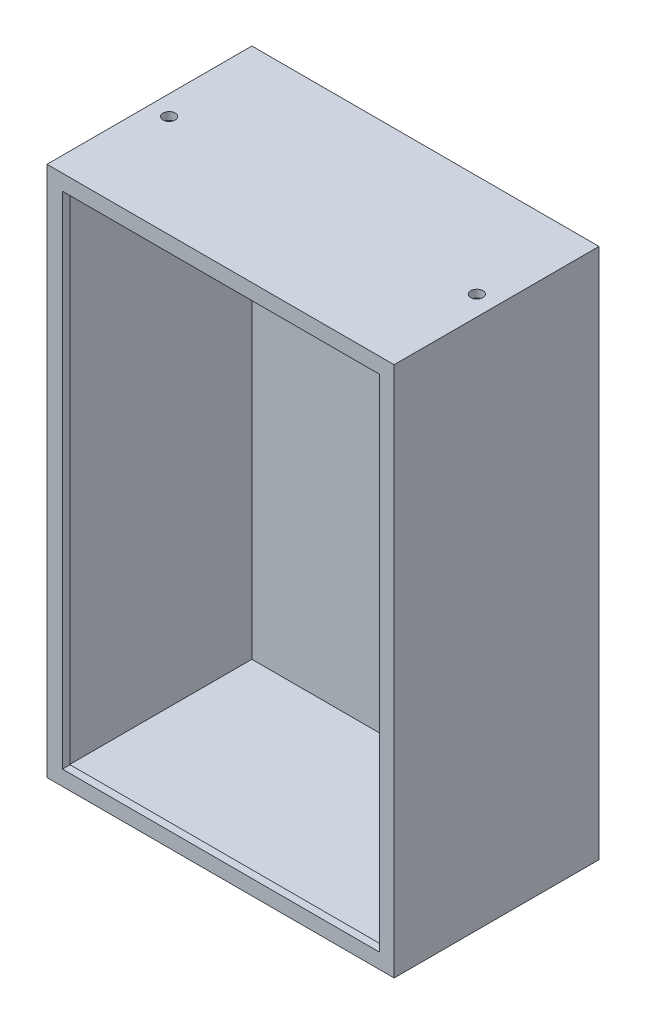
ISO-10303-21;
HEADER;
FILE_DESCRIPTION(('STEP AP214'),'2;1');
FILE_NAME('part.step','',(''),(''),'','','');
FILE_SCHEMA(('AUTOMOTIVE_DESIGN { 1 0 10303 214 1 1 1 1 }'));
ENDSEC;
DATA;
#1=APPLICATION_CONTEXT('core data for automotive mechanical design processes');
#2=APPLICATION_PROTOCOL_DEFINITION('international standard','automotive_design',2000,#1);
#3=PRODUCT_CONTEXT('',#1,'mechanical');
#4=PRODUCT('Part','Part','',(#3));
#5=PRODUCT_RELATED_PRODUCT_CATEGORY('part','',(#4));
#6=PRODUCT_DEFINITION_FORMATION('','',#4);
#7=PRODUCT_DEFINITION_CONTEXT('part definition',#1,'design');
#8=PRODUCT_DEFINITION('design','',#6,#7);
#9=PRODUCT_DEFINITION_SHAPE('','',#8);
#10=(LENGTH_UNIT() NAMED_UNIT(*) SI_UNIT(.MILLI.,.METRE.));
#11=(NAMED_UNIT(*) PLANE_ANGLE_UNIT() SI_UNIT($,.RADIAN.));
#12=(NAMED_UNIT(*) SI_UNIT($,.STERADIAN.) SOLID_ANGLE_UNIT());
#13=UNCERTAINTY_MEASURE_WITH_UNIT(LENGTH_MEASURE(1.E-05),#10,'distance_accuracy_value','');
#14=(GEOMETRIC_REPRESENTATION_CONTEXT(3) GLOBAL_UNCERTAINTY_ASSIGNED_CONTEXT((#13)) GLOBAL_UNIT_ASSIGNED_CONTEXT((#10,
#11,#12)) REPRESENTATION_CONTEXT('',''));
#15=CARTESIAN_POINT('',(0.,0.,0.));
#16=DIRECTION('',(0.,0.,1.));
#17=DIRECTION('',(1.,0.,0.));
#18=AXIS2_PLACEMENT_3D('',#15,#16,#17);
#19=CARTESIAN_POINT('',(-109.375,345.,62.5));
#20=DIRECTION('',(0.,0.,-1.));
#21=DIRECTION('',(-1.,0.,0.));
#22=AXIS2_PLACEMENT_3D('',#19,#20,#21);
#23=PLANE('',#22);
#24=DIRECTION('',(1.,0.,0.));
#25=VECTOR('',#24,1.);
#26=CARTESIAN_POINT('',(-109.375,5.,62.5));
#27=LINE('',#26,#25);
#28=CARTESIAN_POINT('',(-109.375,5.,62.5));
#29=VERTEX_POINT('',#28);
#30=CARTESIAN_POINT('',(109.375,5.,62.5));
#31=VERTEX_POINT('',#30);
#32=EDGE_CURVE('E180',#29,#31,#27,.T.);
#33=ORIENTED_EDGE('',*,*,#32,.F.);
#34=DIRECTION('',(0.,-1.,0.));
#35=VECTOR('',#34,1.);
#36=CARTESIAN_POINT('',(-109.375,345.,62.5));
#37=LINE('',#36,#35);
#38=CARTESIAN_POINT('',(-109.375,345.,62.5));
#39=VERTEX_POINT('',#38);
#40=EDGE_CURVE('E196',#39,#29,#37,.T.);
#41=ORIENTED_EDGE('',*,*,#40,.F.);
#42=DIRECTION('',(1.,0.,0.));
#43=VECTOR('',#42,1.);
#44=CARTESIAN_POINT('',(-109.375,345.,62.5));
#45=LINE('',#44,#43);
#46=CARTESIAN_POINT('',(109.375,345.,62.5));
#47=VERTEX_POINT('',#46);
#48=EDGE_CURVE('E184',#39,#47,#45,.T.);
#49=ORIENTED_EDGE('',*,*,#48,.T.);
#50=DIRECTION('',(0.,-1.,0.));
#51=VECTOR('',#50,1.);
#52=CARTESIAN_POINT('',(109.375,345.,62.5));
#53=LINE('',#52,#51);
#54=EDGE_CURVE('E186',#47,#31,#53,.T.);
#55=ORIENTED_EDGE('',*,*,#54,.T.);
#56=EDGE_LOOP('',(#33,#41,#49,#55));
#57=FACE_BOUND('',#56,.T.);
#58=DIRECTION('',(-1.,0.,0.));
#59=VECTOR('',#58,1.);
#60=CARTESIAN_POINT('',(-104.164967213493,339.723012652688,62.5));
#61=LINE('',#60,#59);
#62=CARTESIAN_POINT('',(104.74795802118,339.723012652688,62.5));
#63=VERTEX_POINT('',#62);
#64=CARTESIAN_POINT('',(-104.164967213493,339.723012652688,62.5));
#65=VERTEX_POINT('',#64);
#66=EDGE_CURVE('E134',#63,#65,#61,.T.);
#67=ORIENTED_EDGE('',*,*,#66,.T.);
#68=DIRECTION('',(0.,-1.,0.));
#69=VECTOR('',#68,1.);
#70=CARTESIAN_POINT('',(-104.164967213493,339.723012652688,62.5));
#71=LINE('',#70,#69);
#72=CARTESIAN_POINT('',(-104.164967213493,9.93613598716966,62.5));
#73=VERTEX_POINT('',#72);
#74=EDGE_CURVE('E130',#65,#73,#71,.T.);
#75=ORIENTED_EDGE('',*,*,#74,.T.);
#76=DIRECTION('',(1.,0.,0.));
#77=VECTOR('',#76,1.);
#78=CARTESIAN_POINT('',(-104.164967213493,9.93613598716966,62.5));
#79=LINE('',#78,#77);
#80=CARTESIAN_POINT('',(104.74795802118,9.93613598716966,62.5));
#81=VERTEX_POINT('',#80);
#82=EDGE_CURVE('E153',#73,#81,#79,.T.);
#83=ORIENTED_EDGE('',*,*,#82,.T.);
#84=DIRECTION('',(0.,1.,0.));
#85=VECTOR('',#84,1.);
#86=CARTESIAN_POINT('',(104.74795802118,339.723012652688,62.5));
#87=LINE('',#86,#85);
#88=EDGE_CURVE('E133',#81,#63,#87,.T.);
#89=ORIENTED_EDGE('',*,*,#88,.T.);
#90=EDGE_LOOP('',(#67,#75,#83,#89));
#91=FACE_BOUND('',#90,.T.);
#92=ADVANCED_FACE('F38',(#57,#91),#23,.T.);
#93=CARTESIAN_POINT('',(109.375,345.,62.5));
#94=DIRECTION('',(-1.,0.,0.));
#95=DIRECTION('',(0.,0.,1.));
#96=AXIS2_PLACEMENT_3D('',#93,#94,#95);
#97=PLANE('',#96);
#98=DIRECTION('',(0.,0.,-1.));
#99=VECTOR('',#98,1.);
#100=CARTESIAN_POINT('',(109.375,5.,62.5));
#101=LINE('',#100,#99);
#102=CARTESIAN_POINT('',(109.375,5.,-62.5));
#103=VERTEX_POINT('',#102);
#104=EDGE_CURVE('E171',#31,#103,#101,.T.);
#105=ORIENTED_EDGE('',*,*,#104,.F.);
#106=ORIENTED_EDGE('',*,*,#54,.F.);
#107=DIRECTION('',(0.,0.,-1.));
#108=VECTOR('',#107,1.);
#109=CARTESIAN_POINT('',(109.375,345.,62.5));
#110=LINE('',#109,#108);
#111=CARTESIAN_POINT('',(109.375,345.,-62.5));
#112=VERTEX_POINT('',#111);
#113=EDGE_CURVE('E176',#47,#112,#110,.T.);
#114=ORIENTED_EDGE('',*,*,#113,.T.);
#115=DIRECTION('',(0.,-1.,0.));
#116=VECTOR('',#115,1.);
#117=CARTESIAN_POINT('',(109.375,345.,-62.5));
#118=LINE('',#117,#116);
#119=EDGE_CURVE('E202',#112,#103,#118,.T.);
#120=ORIENTED_EDGE('',*,*,#119,.T.);
#121=EDGE_LOOP('',(#105,#106,#114,#120));
#122=FACE_BOUND('',#121,.T.);
#123=ADVANCED_FACE('F256',(#122),#97,.T.);
#124=CARTESIAN_POINT('',(-109.375,345.,-62.5));
#125=DIRECTION('',(0.,0.,1.));
#126=DIRECTION('',(1.,0.,0.));
#127=AXIS2_PLACEMENT_3D('',#124,#125,#126);
#128=PLANE('',#127);
#129=DIRECTION('',(-1.,0.,0.));
#130=VECTOR('',#129,1.);
#131=CARTESIAN_POINT('',(-109.375,5.,-62.5));
#132=LINE('',#131,#130);
#133=CARTESIAN_POINT('',(-109.375,5.,-62.5));
#134=VERTEX_POINT('',#133);
#135=EDGE_CURVE('E189',#103,#134,#132,.T.);
#136=ORIENTED_EDGE('',*,*,#135,.F.);
#137=ORIENTED_EDGE('',*,*,#119,.F.);
#138=DIRECTION('',(-1.,0.,0.));
#139=VECTOR('',#138,1.);
#140=CARTESIAN_POINT('',(-109.375,345.,-62.5));
#141=LINE('',#140,#139);
#142=CARTESIAN_POINT('',(-109.375,345.,-62.5));
#143=VERTEX_POINT('',#142);
#144=EDGE_CURVE('E179',#112,#143,#141,.T.);
#145=ORIENTED_EDGE('',*,*,#144,.T.);
#146=DIRECTION('',(0.,-1.,0.));
#147=VECTOR('',#146,1.);
#148=CARTESIAN_POINT('',(-109.375,345.,-62.5));
#149=LINE('',#148,#147);
#150=EDGE_CURVE('E199',#143,#134,#149,.T.);
#151=ORIENTED_EDGE('',*,*,#150,.T.);
#152=EDGE_LOOP('',(#136,#137,#145,#151));
#153=FACE_BOUND('',#152,.T.);
#154=ADVANCED_FACE('F262',(#153),#128,.T.);
#155=CARTESIAN_POINT('',(-109.375,345.,62.5));
#156=DIRECTION('',(1.,0.,0.));
#157=DIRECTION('',(0.,0.,-1.));
#158=AXIS2_PLACEMENT_3D('',#155,#156,#157);
#159=PLANE('',#158);
#160=DIRECTION('',(0.,0.,1.));
#161=VECTOR('',#160,1.);
#162=CARTESIAN_POINT('',(-109.375,5.,62.5));
#163=LINE('',#162,#161);
#164=EDGE_CURVE('E191',#134,#29,#163,.T.);
#165=ORIENTED_EDGE('',*,*,#164,.F.);
#166=ORIENTED_EDGE('',*,*,#150,.F.);
#167=DIRECTION('',(0.,0.,1.));
#168=VECTOR('',#167,1.);
#169=CARTESIAN_POINT('',(-109.375,345.,62.5));
#170=LINE('',#169,#168);
#171=EDGE_CURVE('E182',#143,#39,#170,.T.);
#172=ORIENTED_EDGE('',*,*,#171,.T.);
#173=ORIENTED_EDGE('',*,*,#40,.T.);
#174=EDGE_LOOP('',(#165,#166,#172,#173));
#175=FACE_BOUND('',#174,.T.);
#176=ADVANCED_FACE('F271',(#175),#159,.T.);
#177=CARTESIAN_POINT('',(0.,345.,0.));
#178=DIRECTION('',(0.,1.,0.));
#179=DIRECTION('',(0.,0.,1.));
#180=AXIS2_PLACEMENT_3D('',#177,#178,#179);
#181=PLANE('',#180);
#182=CARTESIAN_POINT('',(-101.375,345.,0.));
#183=DIRECTION('',(0.,1.,0.));
#184=DIRECTION('',(0.,0.,1.));
#185=AXIS2_PLACEMENT_3D('',#182,#183,#184);
#186=CIRCLE('',#185,4.00000000000001);
#187=CARTESIAN_POINT('',(-101.375,345.,4.00000000000001));
#188=VERTEX_POINT('',#187);
#189=EDGE_CURVE('E164',#188,#188,#186,.F.);
#190=ORIENTED_EDGE('',*,*,#189,.F.);
#191=EDGE_LOOP('',(#190));
#192=FACE_BOUND('',#191,.T.);
#193=CARTESIAN_POINT('',(101.375,345.,0.));
#194=DIRECTION('',(0.,1.,0.));
#195=DIRECTION('',(0.,0.,1.));
#196=AXIS2_PLACEMENT_3D('',#193,#194,#195);
#197=CIRCLE('',#196,4.00000000000001);
#198=CARTESIAN_POINT('',(101.375,345.,3.99999999999998));
#199=VERTEX_POINT('',#198);
#200=EDGE_CURVE('E144',#199,#199,#197,.F.);
#201=ORIENTED_EDGE('',*,*,#200,.F.);
#202=EDGE_LOOP('',(#201));
#203=FACE_BOUND('',#202,.T.);
#204=ORIENTED_EDGE('',*,*,#113,.F.);
#205=ORIENTED_EDGE('',*,*,#48,.F.);
#206=ORIENTED_EDGE('',*,*,#171,.F.);
#207=ORIENTED_EDGE('',*,*,#144,.F.);
#208=EDGE_LOOP('',(#204,#205,#206,#207));
#209=FACE_BOUND('',#208,.T.);
#210=ADVANCED_FACE('F274',(#192,#203,#209),#181,.F.);
#211=CARTESIAN_POINT('',(0.,5.,0.));
#212=DIRECTION('',(0.,1.,0.));
#213=DIRECTION('',(0.,0.,1.));
#214=AXIS2_PLACEMENT_3D('',#211,#212,#213);
#215=PLANE('',#214);
#216=ORIENTED_EDGE('',*,*,#104,.T.);
#217=ORIENTED_EDGE('',*,*,#135,.T.);
#218=ORIENTED_EDGE('',*,*,#164,.T.);
#219=ORIENTED_EDGE('',*,*,#32,.T.);
#220=EDGE_LOOP('',(#216,#217,#218,#219));
#221=FACE_BOUND('',#220,.T.);
#222=ADVANCED_FACE('F269',(#221),#215,.T.);
#223=CARTESIAN_POINT('',(101.375,-0.000999999999973245,0.));
#224=DIRECTION('',(0.,1.,0.));
#225=DIRECTION('',(0.,0.,1.));
#226=AXIS2_PLACEMENT_3D('',#223,#224,#225);
#227=CYLINDRICAL_SURFACE('',#226,4.00000000000001);
#228=CARTESIAN_POINT('',(101.375,350.,0.));
#229=DIRECTION('',(0.,1.,0.));
#230=DIRECTION('',(0.,0.,-1.));
#231=AXIS2_PLACEMENT_3D('',#228,#229,#230);
#232=CIRCLE('',#231,4.00000000000001);
#233=CARTESIAN_POINT('',(101.375,350.,-4.00000000000003));
#234=VERTEX_POINT('',#233);
#235=EDGE_CURVE('E168',#234,#234,#232,.T.);
#236=ORIENTED_EDGE('',*,*,#235,.T.);
#237=EDGE_LOOP('',(#236));
#238=FACE_BOUND('',#237,.T.);
#239=ORIENTED_EDGE('',*,*,#200,.T.);
#240=EDGE_LOOP('',(#239));
#241=FACE_BOUND('',#240,.T.);
#242=ADVANCED_FACE('F345',(#238,#241),#227,.F.);
#243=CARTESIAN_POINT('',(-101.375,-0.000999999999973245,0.));
#244=DIRECTION('',(0.,1.,0.));
#245=DIRECTION('',(0.,0.,1.));
#246=AXIS2_PLACEMENT_3D('',#243,#244,#245);
#247=CYLINDRICAL_SURFACE('',#246,4.00000000000001);
#248=CARTESIAN_POINT('',(-101.375,350.,0.));
#249=DIRECTION('',(0.,1.,0.));
#250=DIRECTION('',(0.,0.,1.));
#251=AXIS2_PLACEMENT_3D('',#248,#249,#250);
#252=CIRCLE('',#251,4.00000000000001);
#253=CARTESIAN_POINT('',(-101.375,350.,4.00000000000001));
#254=VERTEX_POINT('',#253);
#255=EDGE_CURVE('E167',#254,#254,#252,.T.);
#256=ORIENTED_EDGE('',*,*,#255,.T.);
#257=EDGE_LOOP('',(#256));
#258=FACE_BOUND('',#257,.T.);
#259=ORIENTED_EDGE('',*,*,#189,.T.);
#260=EDGE_LOOP('',(#259));
#261=FACE_BOUND('',#260,.T.);
#262=ADVANCED_FACE('F254',(#258,#261),#247,.F.);
#263=CARTESIAN_POINT('',(114.375,350.,0.));
#264=DIRECTION('',(-1.,0.,0.));
#265=DIRECTION('',(0.,0.,1.));
#266=AXIS2_PLACEMENT_3D('',#263,#264,#265);
#267=PLANE('',#266);
#268=DIRECTION('',(0.,0.,-1.));
#269=VECTOR('',#268,1.);
#270=CARTESIAN_POINT('',(114.375,0.,0.));
#271=LINE('',#270,#269);
#272=CARTESIAN_POINT('',(114.375,0.,67.5));
#273=VERTEX_POINT('',#272);
#274=CARTESIAN_POINT('',(114.375,0.,-67.5));
#275=VERTEX_POINT('',#274);
#276=EDGE_CURVE('E205',#273,#275,#271,.T.);
#277=ORIENTED_EDGE('',*,*,#276,.T.);
#278=DIRECTION('',(0.,-1.,0.));
#279=VECTOR('',#278,1.);
#280=CARTESIAN_POINT('',(114.375,350.,-67.5));
#281=LINE('',#280,#279);
#282=CARTESIAN_POINT('',(114.375,350.,-67.5));
#283=VERTEX_POINT('',#282);
#284=EDGE_CURVE('E11',#283,#275,#281,.T.);
#285=ORIENTED_EDGE('',*,*,#284,.F.);
#286=DIRECTION('',(0.,0.,-1.));
#287=VECTOR('',#286,1.);
#288=CARTESIAN_POINT('',(114.375,350.,0.));
#289=LINE('',#288,#287);
#290=CARTESIAN_POINT('',(114.375,350.,67.5));
#291=VERTEX_POINT('',#290);
#292=EDGE_CURVE('E206',#291,#283,#289,.T.);
#293=ORIENTED_EDGE('',*,*,#292,.F.);
#294=DIRECTION('',(0.,-1.,0.));
#295=VECTOR('',#294,1.);
#296=CARTESIAN_POINT('',(114.375,350.,67.5));
#297=LINE('',#296,#295);
#298=EDGE_CURVE('E216',#291,#273,#297,.T.);
#299=ORIENTED_EDGE('',*,*,#298,.T.);
#300=EDGE_LOOP('',(#277,#285,#293,#299));
#301=FACE_BOUND('',#300,.T.);
#302=ADVANCED_FACE('F40',(#301),#267,.F.);
#303=CARTESIAN_POINT('',(0.,350.,-67.5));
#304=DIRECTION('',(0.,0.,1.));
#305=DIRECTION('',(1.,0.,0.));
#306=AXIS2_PLACEMENT_3D('',#303,#304,#305);
#307=PLANE('',#306);
#308=DIRECTION('',(-1.,0.,0.));
#309=VECTOR('',#308,1.);
#310=CARTESIAN_POINT('',(0.,0.,-67.5));
#311=LINE('',#310,#309);
#312=CARTESIAN_POINT('',(-114.375,0.,-67.5));
#313=VERTEX_POINT('',#312);
#314=EDGE_CURVE('E219',#275,#313,#311,.T.);
#315=ORIENTED_EDGE('',*,*,#314,.T.);
#316=DIRECTION('',(0.,-1.,0.));
#317=VECTOR('',#316,1.);
#318=CARTESIAN_POINT('',(-114.375,350.,-67.5));
#319=LINE('',#318,#317);
#320=CARTESIAN_POINT('',(-114.375,350.,-67.5));
#321=VERTEX_POINT('',#320);
#322=EDGE_CURVE('E46',#321,#313,#319,.T.);
#323=ORIENTED_EDGE('',*,*,#322,.F.);
#324=DIRECTION('',(-1.,0.,0.));
#325=VECTOR('',#324,1.);
#326=CARTESIAN_POINT('',(0.,350.,-67.5));
#327=LINE('',#326,#325);
#328=EDGE_CURVE('E209',#283,#321,#327,.T.);
#329=ORIENTED_EDGE('',*,*,#328,.F.);
#330=ORIENTED_EDGE('',*,*,#284,.T.);
#331=EDGE_LOOP('',(#315,#323,#329,#330));
#332=FACE_BOUND('',#331,.T.);
#333=ADVANCED_FACE('F247',(#332),#307,.F.);
#334=CARTESIAN_POINT('',(-114.375,350.,0.));
#335=DIRECTION('',(1.,0.,0.));
#336=DIRECTION('',(0.,0.,-1.));
#337=AXIS2_PLACEMENT_3D('',#334,#335,#336);
#338=PLANE('',#337);
#339=DIRECTION('',(0.,0.,1.));
#340=VECTOR('',#339,1.);
#341=CARTESIAN_POINT('',(-114.375,0.,0.));
#342=LINE('',#341,#340);
#343=CARTESIAN_POINT('',(-114.375,0.,67.5));
#344=VERTEX_POINT('',#343);
#345=EDGE_CURVE('E221',#313,#344,#342,.T.);
#346=ORIENTED_EDGE('',*,*,#345,.T.);
#347=DIRECTION('',(0.,-1.,0.));
#348=VECTOR('',#347,1.);
#349=CARTESIAN_POINT('',(-114.375,350.,67.5));
#350=LINE('',#349,#348);
#351=CARTESIAN_POINT('',(-114.375,350.,67.5));
#352=VERTEX_POINT('',#351);
#353=EDGE_CURVE('E226',#352,#344,#350,.T.);
#354=ORIENTED_EDGE('',*,*,#353,.F.);
#355=DIRECTION('',(0.,0.,1.));
#356=VECTOR('',#355,1.);
#357=CARTESIAN_POINT('',(-114.375,350.,0.));
#358=LINE('',#357,#356);
#359=EDGE_CURVE('E212',#321,#352,#358,.T.);
#360=ORIENTED_EDGE('',*,*,#359,.F.);
#361=ORIENTED_EDGE('',*,*,#322,.T.);
#362=EDGE_LOOP('',(#346,#354,#360,#361));
#363=FACE_BOUND('',#362,.T.);
#364=ADVANCED_FACE('F233',(#363),#338,.F.);
#365=CARTESIAN_POINT('',(0.,350.,67.5));
#366=DIRECTION('',(0.,0.,-1.));
#367=DIRECTION('',(-1.,0.,0.));
#368=AXIS2_PLACEMENT_3D('',#365,#366,#367);
#369=PLANE('',#368);
#370=DIRECTION('',(1.,0.,0.));
#371=VECTOR('',#370,1.);
#372=CARTESIAN_POINT('',(-104.164967213493,9.93613598716966,67.5));
#373=LINE('',#372,#371);
#374=CARTESIAN_POINT('',(-104.164967213493,9.93613598716969,67.5));
#375=VERTEX_POINT('',#374);
#376=CARTESIAN_POINT('',(104.74795802118,9.93613598716966,67.5));
#377=VERTEX_POINT('',#376);
#378=EDGE_CURVE('E150',#375,#377,#373,.T.);
#379=ORIENTED_EDGE('',*,*,#378,.F.);
#380=DIRECTION('',(0.,-1.,0.));
#381=VECTOR('',#380,1.);
#382=CARTESIAN_POINT('',(-104.164967213493,339.723012652688,67.5));
#383=LINE('',#382,#381);
#384=CARTESIAN_POINT('',(-104.164967213493,339.723012652688,67.5));
#385=VERTEX_POINT('',#384);
#386=EDGE_CURVE('E61',#385,#375,#383,.T.);
#387=ORIENTED_EDGE('',*,*,#386,.F.);
#388=DIRECTION('',(-1.,0.,0.));
#389=VECTOR('',#388,1.);
#390=CARTESIAN_POINT('',(-104.164967213493,339.723012652688,67.5));
#391=LINE('',#390,#389);
#392=CARTESIAN_POINT('',(104.74795802118,339.723012652688,67.5));
#393=VERTEX_POINT('',#392);
#394=EDGE_CURVE('E137',#393,#385,#391,.T.);
#395=ORIENTED_EDGE('',*,*,#394,.F.);
#396=DIRECTION('',(0.,1.,0.));
#397=VECTOR('',#396,1.);
#398=CARTESIAN_POINT('',(104.74795802118,339.723012652688,67.5));
#399=LINE('',#398,#397);
#400=EDGE_CURVE('E145',#377,#393,#399,.T.);
#401=ORIENTED_EDGE('',*,*,#400,.F.);
#402=EDGE_LOOP('',(#379,#387,#395,#401));
#403=FACE_BOUND('',#402,.T.);
#404=DIRECTION('',(1.,0.,0.));
#405=VECTOR('',#404,1.);
#406=CARTESIAN_POINT('',(0.,0.,67.5));
#407=LINE('',#406,#405);
#408=EDGE_CURVE('E210',#344,#273,#407,.T.);
#409=ORIENTED_EDGE('',*,*,#408,.T.);
#410=ORIENTED_EDGE('',*,*,#298,.F.);
#411=DIRECTION('',(1.,0.,0.));
#412=VECTOR('',#411,1.);
#413=CARTESIAN_POINT('',(0.,350.,67.5));
#414=LINE('',#413,#412);
#415=EDGE_CURVE('E214',#352,#291,#414,.T.);
#416=ORIENTED_EDGE('',*,*,#415,.F.);
#417=ORIENTED_EDGE('',*,*,#353,.T.);
#418=EDGE_LOOP('',(#409,#410,#416,#417));
#419=FACE_BOUND('',#418,.T.);
#420=ADVANCED_FACE('F148',(#403,#419),#369,.F.);
#421=CARTESIAN_POINT('',(0.,350.,0.));
#422=DIRECTION('',(0.,1.,0.));
#423=DIRECTION('',(0.,0.,1.));
#424=AXIS2_PLACEMENT_3D('',#421,#422,#423);
#425=PLANE('',#424);
#426=ORIENTED_EDGE('',*,*,#255,.F.);
#427=EDGE_LOOP('',(#426));
#428=FACE_BOUND('',#427,.T.);
#429=ORIENTED_EDGE('',*,*,#235,.F.);
#430=EDGE_LOOP('',(#429));
#431=FACE_BOUND('',#430,.T.);
#432=ORIENTED_EDGE('',*,*,#292,.T.);
#433=ORIENTED_EDGE('',*,*,#328,.T.);
#434=ORIENTED_EDGE('',*,*,#359,.T.);
#435=ORIENTED_EDGE('',*,*,#415,.T.);
#436=EDGE_LOOP('',(#432,#433,#434,#435));
#437=FACE_BOUND('',#436,.T.);
#438=ADVANCED_FACE('F246',(#428,#431,#437),#425,.T.);
#439=CARTESIAN_POINT('',(0.,0.,0.));
#440=DIRECTION('',(0.,1.,0.));
#441=DIRECTION('',(0.,0.,1.));
#442=AXIS2_PLACEMENT_3D('',#439,#440,#441);
#443=PLANE('',#442);
#444=ORIENTED_EDGE('',*,*,#276,.F.);
#445=ORIENTED_EDGE('',*,*,#408,.F.);
#446=ORIENTED_EDGE('',*,*,#345,.F.);
#447=ORIENTED_EDGE('',*,*,#314,.F.);
#448=EDGE_LOOP('',(#444,#445,#446,#447));
#449=FACE_BOUND('',#448,.T.);
#450=ADVANCED_FACE('F239',(#449),#443,.F.);
#451=CARTESIAN_POINT('',(-104.164967213493,339.723012652688,-67.501));
#452=DIRECTION('',(-1.,0.,0.));
#453=DIRECTION('',(0.,0.,1.));
#454=AXIS2_PLACEMENT_3D('',#451,#452,#453);
#455=PLANE('',#454);
#456=DIRECTION('',(0.,0.,1.));
#457=VECTOR('',#456,1.);
#458=CARTESIAN_POINT('',(-104.164967213493,339.723012652688,-67.501));
#459=LINE('',#458,#457);
#460=EDGE_CURVE('E126',#65,#385,#459,.T.);
#461=ORIENTED_EDGE('',*,*,#460,.T.);
#462=ORIENTED_EDGE('',*,*,#386,.T.);
#463=DIRECTION('',(0.,0.,1.));
#464=VECTOR('',#463,1.);
#465=CARTESIAN_POINT('',(-104.164967213493,9.93613598716966,-67.501));
#466=LINE('',#465,#464);
#467=EDGE_CURVE('E158',#73,#375,#466,.T.);
#468=ORIENTED_EDGE('',*,*,#467,.F.);
#469=ORIENTED_EDGE('',*,*,#74,.F.);
#470=EDGE_LOOP('',(#461,#462,#468,#469));
#471=FACE_BOUND('',#470,.T.);
#472=ADVANCED_FACE('F128',(#471),#455,.F.);
#473=CARTESIAN_POINT('',(-104.164967213493,339.723012652688,-67.501));
#474=DIRECTION('',(0.,1.,0.));
#475=DIRECTION('',(0.,0.,1.));
#476=AXIS2_PLACEMENT_3D('',#473,#474,#475);
#477=PLANE('',#476);
#478=DIRECTION('',(0.,0.,1.));
#479=VECTOR('',#478,1.);
#480=CARTESIAN_POINT('',(104.74795802118,339.723012652688,-67.501));
#481=LINE('',#480,#479);
#482=EDGE_CURVE('E140',#63,#393,#481,.T.);
#483=ORIENTED_EDGE('',*,*,#482,.T.);
#484=ORIENTED_EDGE('',*,*,#394,.T.);
#485=ORIENTED_EDGE('',*,*,#460,.F.);
#486=ORIENTED_EDGE('',*,*,#66,.F.);
#487=EDGE_LOOP('',(#483,#484,#485,#486));
#488=FACE_BOUND('',#487,.T.);
#489=ADVANCED_FACE('F138',(#488),#477,.F.);
#490=CARTESIAN_POINT('',(104.74795802118,339.723012652688,-67.501));
#491=DIRECTION('',(1.,0.,0.));
#492=DIRECTION('',(0.,0.,-1.));
#493=AXIS2_PLACEMENT_3D('',#490,#491,#492);
#494=PLANE('',#493);
#495=DIRECTION('',(0.,0.,1.));
#496=VECTOR('',#495,1.);
#497=CARTESIAN_POINT('',(104.74795802118,9.93613598716966,-67.501));
#498=LINE('',#497,#496);
#499=EDGE_CURVE('E53',#81,#377,#498,.T.);
#500=ORIENTED_EDGE('',*,*,#499,.T.);
#501=ORIENTED_EDGE('',*,*,#400,.T.);
#502=ORIENTED_EDGE('',*,*,#482,.F.);
#503=ORIENTED_EDGE('',*,*,#88,.F.);
#504=EDGE_LOOP('',(#500,#501,#502,#503));
#505=FACE_BOUND('',#504,.T.);
#506=ADVANCED_FACE('F311',(#505),#494,.F.);
#507=CARTESIAN_POINT('',(-104.164967213493,9.93613598716966,-67.501));
#508=DIRECTION('',(0.,-1.,0.));
#509=DIRECTION('',(0.,0.,-1.));
#510=AXIS2_PLACEMENT_3D('',#507,#508,#509);
#511=PLANE('',#510);
#512=ORIENTED_EDGE('',*,*,#467,.T.);
#513=ORIENTED_EDGE('',*,*,#378,.T.);
#514=ORIENTED_EDGE('',*,*,#499,.F.);
#515=ORIENTED_EDGE('',*,*,#82,.F.);
#516=EDGE_LOOP('',(#512,#513,#514,#515));
#517=FACE_BOUND('',#516,.T.);
#518=ADVANCED_FACE('F318',(#517),#511,.F.);
#519=CLOSED_SHELL('',(#92,#123,#154,#176,#210,#222,#242,#262,#302,#333,#364,#420,#438,#450,#472,
#489,#506,#518));
#520=MANIFOLD_SOLID_BREP('B2',#519);
#521=ADVANCED_BREP_SHAPE_REPRESENTATION('',(#18,#520),#14);
#522=SHAPE_DEFINITION_REPRESENTATION(#9,#521);
ENDSEC;
END-ISO-10303-21;
